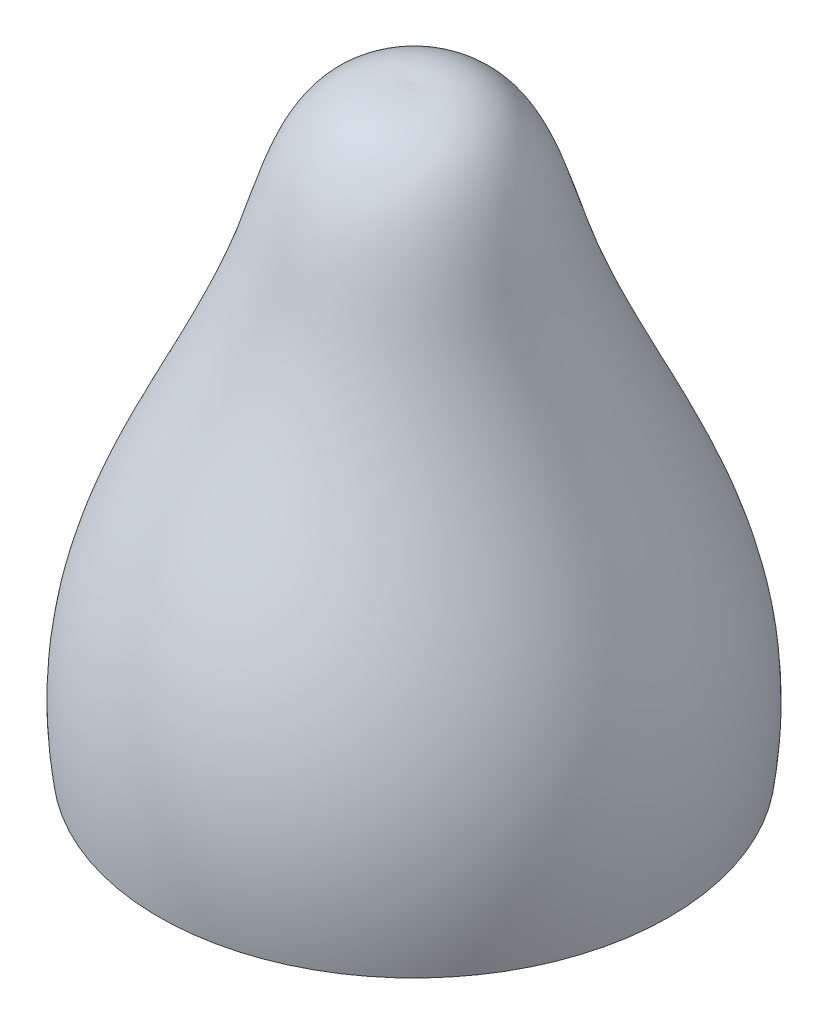
ISO-10303-21;
HEADER;
FILE_DESCRIPTION(('STEP AP214'),'2;1');
FILE_NAME('part.step','',(''),(''),'','','');
FILE_SCHEMA(('AUTOMOTIVE_DESIGN { 1 0 10303 214 1 1 1 1 }'));
ENDSEC;
DATA;
#1=APPLICATION_CONTEXT('core data for automotive mechanical design processes');
#2=APPLICATION_PROTOCOL_DEFINITION('international standard','automotive_design',2000,#1);
#3=PRODUCT_CONTEXT('',#1,'mechanical');
#4=PRODUCT('Part','Part','',(#3));
#5=PRODUCT_RELATED_PRODUCT_CATEGORY('part','',(#4));
#6=PRODUCT_DEFINITION_FORMATION('','',#4);
#7=PRODUCT_DEFINITION_CONTEXT('part definition',#1,'design');
#8=PRODUCT_DEFINITION('design','',#6,#7);
#9=PRODUCT_DEFINITION_SHAPE('','',#8);
#10=(LENGTH_UNIT() NAMED_UNIT(*) SI_UNIT(.MILLI.,.METRE.));
#11=(NAMED_UNIT(*) PLANE_ANGLE_UNIT() SI_UNIT($,.RADIAN.));
#12=(NAMED_UNIT(*) SI_UNIT($,.STERADIAN.) SOLID_ANGLE_UNIT());
#13=UNCERTAINTY_MEASURE_WITH_UNIT(LENGTH_MEASURE(1.E-05),#10,'distance_accuracy_value','');
#14=(GEOMETRIC_REPRESENTATION_CONTEXT(3) GLOBAL_UNCERTAINTY_ASSIGNED_CONTEXT((#13)) GLOBAL_UNIT_ASSIGNED_CONTEXT((#10,
#11,#12)) REPRESENTATION_CONTEXT('',''));
#15=CARTESIAN_POINT('',(0.,0.,0.));
#16=DIRECTION('',(0.,0.,1.));
#17=DIRECTION('',(1.,0.,0.));
#18=AXIS2_PLACEMENT_3D('',#15,#16,#17);
#19=CARTESIAN_POINT('',(0.,0.,0.));
#20=DIRECTION('',(0.,-1.,0.));
#21=DIRECTION('',(0.,0.,-1.));
#22=AXIS2_PLACEMENT_3D('',#19,#20,#21);
#23=PLANE('',#22);
#24=CARTESIAN_POINT('',(0.,0.,0.));
#25=DIRECTION('',(0.,-1.,0.));
#26=DIRECTION('',(0.,0.,-1.));
#27=AXIS2_PLACEMENT_3D('',#24,#25,#26);
#28=CIRCLE('',#27,1.5);
#29=CARTESIAN_POINT('',(0.,0.,-1.5));
#30=VERTEX_POINT('',#29);
#31=EDGE_CURVE('E55',#30,#30,#28,.T.);
#32=ORIENTED_EDGE('',*,*,#31,.F.);
#33=EDGE_LOOP('',(#32));
#34=FACE_BOUND('',#33,.T.);
#35=CARTESIAN_POINT('',(0.,0.,0.));
#36=DIRECTION('',(0.,-1.,0.));
#37=DIRECTION('',(0.,0.,-1.));
#38=AXIS2_PLACEMENT_3D('',#35,#36,#37);
#39=CIRCLE('',#38,3.);
#40=CARTESIAN_POINT('',(0.,0.,-3.));
#41=VERTEX_POINT('',#40);
#42=EDGE_CURVE('E11',#41,#41,#39,.T.);
#43=ORIENTED_EDGE('',*,*,#42,.T.);
#44=EDGE_LOOP('',(#43));
#45=FACE_BOUND('',#44,.T.);
#46=ADVANCED_FACE('F34',(#34,#45),#23,.T.);
#47=CARTESIAN_POINT('',(3.,0.,0.));
#48=CARTESIAN_POINT('',(3.31334651576625,2.22197617912081,0.));
#49=CARTESIAN_POINT('',(1.57845349277007,3.9643530397649,0.));
#50=CARTESIAN_POINT('',(1.06817801389549,7.11148752575224,0.));
#51=CARTESIAN_POINT('',(0.,7.,0.));
#52=B_SPLINE_CURVE_WITH_KNOTS('',3,(#47,#48,#49,#50,#51),.UNSPECIFIED.,.F.,.F.,(4,1,4),(0.,
0.691256586743708,1.),.UNSPECIFIED.);
#53=CARTESIAN_POINT('',(0.,0.,0.));
#54=DIRECTION('',(0.,-1.,0.));
#55=AXIS1_PLACEMENT('',#53,#54);
#56=SURFACE_OF_REVOLUTION('',#52,#55);
#57=CARTESIAN_POINT('',(0.,7.,0.));
#58=VERTEX_POINT('',#57);
#59=VERTEX_LOOP('',#58);
#60=FACE_BOUND('',#59,.T.);
#61=ORIENTED_EDGE('',*,*,#42,.F.);
#62=EDGE_LOOP('',(#61));
#63=FACE_BOUND('',#62,.T.);
#64=ADVANCED_FACE('F43',(#60,#63),#56,.F.);
#65=CARTESIAN_POINT('',(0.,4.,0.));
#66=DIRECTION('',(0.,-1.,0.));
#67=DIRECTION('',(0.,0.,-1.));
#68=AXIS2_PLACEMENT_3D('',#65,#66,#67);
#69=CYLINDRICAL_SURFACE('',#68,1.5);
#70=CARTESIAN_POINT('',(0.,4.,0.));
#71=DIRECTION('',(0.,-1.,0.));
#72=DIRECTION('',(0.,0.,-1.));
#73=AXIS2_PLACEMENT_3D('',#70,#71,#72);
#74=CIRCLE('',#73,1.5);
#75=CARTESIAN_POINT('',(0.,4.,-1.5));
#76=VERTEX_POINT('',#75);
#77=EDGE_CURVE('E40',#76,#76,#74,.T.);
#78=ORIENTED_EDGE('',*,*,#77,.F.);
#79=EDGE_LOOP('',(#78));
#80=FACE_BOUND('',#79,.T.);
#81=ORIENTED_EDGE('',*,*,#31,.T.);
#82=EDGE_LOOP('',(#81));
#83=FACE_BOUND('',#82,.T.);
#84=ADVANCED_FACE('F46',(#80,#83),#69,.F.);
#85=CARTESIAN_POINT('',(0.,4.,0.));
#86=DIRECTION('',(0.,-1.,0.));
#87=DIRECTION('',(0.,0.,-1.));
#88=AXIS2_PLACEMENT_3D('',#85,#86,#87);
#89=PLANE('',#88);
#90=ORIENTED_EDGE('',*,*,#77,.T.);
#91=EDGE_LOOP('',(#90));
#92=FACE_BOUND('',#91,.T.);
#93=ADVANCED_FACE('F69',(#92),#89,.T.);
#94=CLOSED_SHELL('',(#46,#64,#84,#93));
#95=MANIFOLD_SOLID_BREP('B2',#94);
#96=ADVANCED_BREP_SHAPE_REPRESENTATION('',(#18,#95),#14);
#97=SHAPE_DEFINITION_REPRESENTATION(#9,#96);
ENDSEC;
END-ISO-10303-21;
